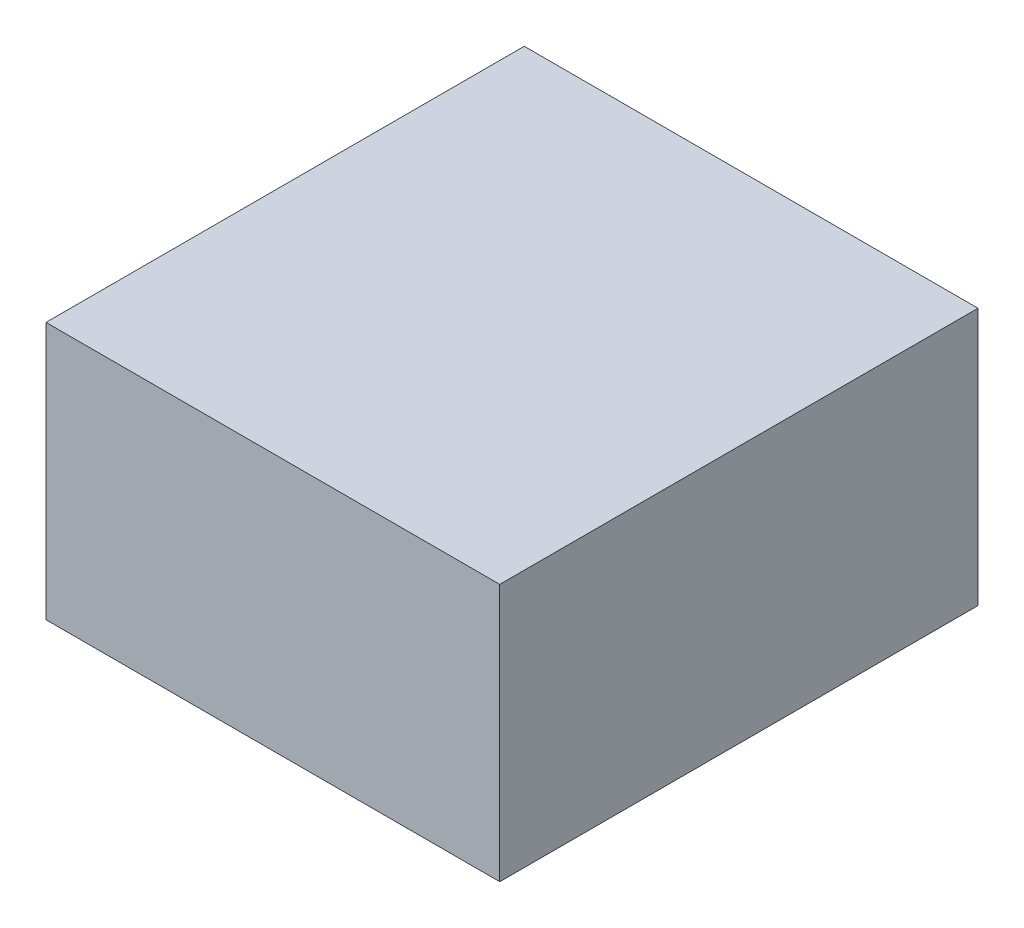
ISO-10303-21;
HEADER;
FILE_DESCRIPTION(('STEP AP214'),'2;1');
FILE_NAME('part.step','',(''),(''),'','','');
FILE_SCHEMA(('AUTOMOTIVE_DESIGN { 1 0 10303 214 1 1 1 1 }'));
ENDSEC;
DATA;
#1=APPLICATION_CONTEXT('core data for automotive mechanical design processes');
#2=APPLICATION_PROTOCOL_DEFINITION('international standard','automotive_design',2000,#1);
#3=PRODUCT_CONTEXT('',#1,'mechanical');
#4=PRODUCT('Part','Part','',(#3));
#5=PRODUCT_RELATED_PRODUCT_CATEGORY('part','',(#4));
#6=PRODUCT_DEFINITION_FORMATION('','',#4);
#7=PRODUCT_DEFINITION_CONTEXT('part definition',#1,'design');
#8=PRODUCT_DEFINITION('design','',#6,#7);
#9=PRODUCT_DEFINITION_SHAPE('','',#8);
#10=(LENGTH_UNIT() NAMED_UNIT(*) SI_UNIT(.MILLI.,.METRE.));
#11=(NAMED_UNIT(*) PLANE_ANGLE_UNIT() SI_UNIT($,.RADIAN.));
#12=(NAMED_UNIT(*) SI_UNIT($,.STERADIAN.) SOLID_ANGLE_UNIT());
#13=UNCERTAINTY_MEASURE_WITH_UNIT(LENGTH_MEASURE(1.E-05),#10,'distance_accuracy_value','');
#14=(GEOMETRIC_REPRESENTATION_CONTEXT(3) GLOBAL_UNCERTAINTY_ASSIGNED_CONTEXT((#13)) GLOBAL_UNIT_ASSIGNED_CONTEXT((#10,
#11,#12)) REPRESENTATION_CONTEXT('',''));
#15=CARTESIAN_POINT('',(0.,0.,0.));
#16=DIRECTION('',(0.,0.,1.));
#17=DIRECTION('',(1.,0.,0.));
#18=AXIS2_PLACEMENT_3D('',#15,#16,#17);
#19=CARTESIAN_POINT('',(185.,210.,195.));
#20=DIRECTION('',(-1.,0.,0.));
#21=DIRECTION('',(0.,0.,1.));
#22=AXIS2_PLACEMENT_3D('',#19,#20,#21);
#23=PLANE('',#22);
#24=DIRECTION('',(0.,0.,-1.));
#25=VECTOR('',#24,1.);
#26=CARTESIAN_POINT('',(185.,0.,195.));
#27=LINE('',#26,#25);
#28=CARTESIAN_POINT('',(185.,0.,195.));
#29=VERTEX_POINT('',#28);
#30=CARTESIAN_POINT('',(185.,0.,-195.));
#31=VERTEX_POINT('',#30);
#32=EDGE_CURVE('E113',#29,#31,#27,.T.);
#33=ORIENTED_EDGE('',*,*,#32,.T.);
#34=DIRECTION('',(0.,-1.,0.));
#35=VECTOR('',#34,1.);
#36=CARTESIAN_POINT('',(185.,210.,-195.));
#37=LINE('',#36,#35);
#38=CARTESIAN_POINT('',(185.,210.,-195.));
#39=VERTEX_POINT('',#38);
#40=EDGE_CURVE('E11',#39,#31,#37,.T.);
#41=ORIENTED_EDGE('',*,*,#40,.F.);
#42=DIRECTION('',(0.,0.,-1.));
#43=VECTOR('',#42,1.);
#44=CARTESIAN_POINT('',(185.,210.,195.));
#45=LINE('',#44,#43);
#46=CARTESIAN_POINT('',(185.,210.,195.));
#47=VERTEX_POINT('',#46);
#48=EDGE_CURVE('E97',#47,#39,#45,.T.);
#49=ORIENTED_EDGE('',*,*,#48,.F.);
#50=DIRECTION('',(0.,-1.,0.));
#51=VECTOR('',#50,1.);
#52=CARTESIAN_POINT('',(185.,210.,195.));
#53=LINE('',#52,#51);
#54=EDGE_CURVE('E109',#47,#29,#53,.T.);
#55=ORIENTED_EDGE('',*,*,#54,.T.);
#56=EDGE_LOOP('',(#33,#41,#49,#55));
#57=FACE_BOUND('',#56,.T.);
#58=ADVANCED_FACE('F45',(#57),#23,.F.);
#59=CARTESIAN_POINT('',(-185.,210.,-195.));
#60=DIRECTION('',(0.,0.,1.));
#61=DIRECTION('',(1.,0.,0.));
#62=AXIS2_PLACEMENT_3D('',#59,#60,#61);
#63=PLANE('',#62);
#64=DIRECTION('',(-1.,0.,0.));
#65=VECTOR('',#64,1.);
#66=CARTESIAN_POINT('',(-185.,0.,-195.));
#67=LINE('',#66,#65);
#68=CARTESIAN_POINT('',(-185.,0.,-195.));
#69=VERTEX_POINT('',#68);
#70=EDGE_CURVE('E102',#31,#69,#67,.T.);
#71=ORIENTED_EDGE('',*,*,#70,.T.);
#72=DIRECTION('',(0.,-1.,0.));
#73=VECTOR('',#72,1.);
#74=CARTESIAN_POINT('',(-185.,210.,-195.));
#75=LINE('',#74,#73);
#76=CARTESIAN_POINT('',(-185.,210.,-195.));
#77=VERTEX_POINT('',#76);
#78=EDGE_CURVE('E54',#77,#69,#75,.T.);
#79=ORIENTED_EDGE('',*,*,#78,.F.);
#80=DIRECTION('',(-1.,0.,0.));
#81=VECTOR('',#80,1.);
#82=CARTESIAN_POINT('',(-185.,210.,-195.));
#83=LINE('',#82,#81);
#84=EDGE_CURVE('E92',#39,#77,#83,.T.);
#85=ORIENTED_EDGE('',*,*,#84,.F.);
#86=ORIENTED_EDGE('',*,*,#40,.T.);
#87=EDGE_LOOP('',(#71,#79,#85,#86));
#88=FACE_BOUND('',#87,.T.);
#89=ADVANCED_FACE('F101',(#88),#63,.F.);
#90=CARTESIAN_POINT('',(-185.,210.,195.));
#91=DIRECTION('',(1.,0.,0.));
#92=DIRECTION('',(0.,0.,-1.));
#93=AXIS2_PLACEMENT_3D('',#90,#91,#92);
#94=PLANE('',#93);
#95=DIRECTION('',(0.,0.,1.));
#96=VECTOR('',#95,1.);
#97=CARTESIAN_POINT('',(-185.,0.,195.));
#98=LINE('',#97,#96);
#99=CARTESIAN_POINT('',(-185.,0.,195.));
#100=VERTEX_POINT('',#99);
#101=EDGE_CURVE('E79',#69,#100,#98,.T.);
#102=ORIENTED_EDGE('',*,*,#101,.T.);
#103=DIRECTION('',(0.,-1.,0.));
#104=VECTOR('',#103,1.);
#105=CARTESIAN_POINT('',(-185.,210.,195.));
#106=LINE('',#105,#104);
#107=CARTESIAN_POINT('',(-185.,210.,195.));
#108=VERTEX_POINT('',#107);
#109=EDGE_CURVE('E104',#108,#100,#106,.T.);
#110=ORIENTED_EDGE('',*,*,#109,.F.);
#111=DIRECTION('',(0.,0.,1.));
#112=VECTOR('',#111,1.);
#113=CARTESIAN_POINT('',(-185.,210.,195.));
#114=LINE('',#113,#112);
#115=EDGE_CURVE('E95',#77,#108,#114,.T.);
#116=ORIENTED_EDGE('',*,*,#115,.F.);
#117=ORIENTED_EDGE('',*,*,#78,.T.);
#118=EDGE_LOOP('',(#102,#110,#116,#117));
#119=FACE_BOUND('',#118,.T.);
#120=ADVANCED_FACE('F105',(#119),#94,.F.);
#121=CARTESIAN_POINT('',(-185.,210.,195.));
#122=DIRECTION('',(0.,0.,-1.));
#123=DIRECTION('',(-1.,0.,0.));
#124=AXIS2_PLACEMENT_3D('',#121,#122,#123);
#125=PLANE('',#124);
#126=DIRECTION('',(1.,0.,0.));
#127=VECTOR('',#126,1.);
#128=CARTESIAN_POINT('',(-185.,0.,195.));
#129=LINE('',#128,#127);
#130=EDGE_CURVE('E85',#100,#29,#129,.T.);
#131=ORIENTED_EDGE('',*,*,#130,.T.);
#132=ORIENTED_EDGE('',*,*,#54,.F.);
#133=DIRECTION('',(1.,0.,0.));
#134=VECTOR('',#133,1.);
#135=CARTESIAN_POINT('',(-185.,210.,195.));
#136=LINE('',#135,#134);
#137=EDGE_CURVE('E62',#108,#47,#136,.T.);
#138=ORIENTED_EDGE('',*,*,#137,.F.);
#139=ORIENTED_EDGE('',*,*,#109,.T.);
#140=EDGE_LOOP('',(#131,#132,#138,#139));
#141=FACE_BOUND('',#140,.T.);
#142=ADVANCED_FACE('F126',(#141),#125,.F.);
#143=CARTESIAN_POINT('',(0.,210.,0.));
#144=DIRECTION('',(0.,-1.,0.));
#145=DIRECTION('',(0.,0.,-1.));
#146=AXIS2_PLACEMENT_3D('',#143,#144,#145);
#147=PLANE('',#146);
#148=ORIENTED_EDGE('',*,*,#48,.T.);
#149=ORIENTED_EDGE('',*,*,#84,.T.);
#150=ORIENTED_EDGE('',*,*,#115,.T.);
#151=ORIENTED_EDGE('',*,*,#137,.T.);
#152=EDGE_LOOP('',(#148,#149,#150,#151));
#153=FACE_BOUND('',#152,.T.);
#154=ADVANCED_FACE('F93',(#153),#147,.F.);
#155=CARTESIAN_POINT('',(0.,0.,0.));
#156=DIRECTION('',(0.,-1.,0.));
#157=DIRECTION('',(0.,0.,-1.));
#158=AXIS2_PLACEMENT_3D('',#155,#156,#157);
#159=PLANE('',#158);
#160=ORIENTED_EDGE('',*,*,#32,.F.);
#161=ORIENTED_EDGE('',*,*,#130,.F.);
#162=ORIENTED_EDGE('',*,*,#101,.F.);
#163=ORIENTED_EDGE('',*,*,#70,.F.);
#164=EDGE_LOOP('',(#160,#161,#162,#163));
#165=FACE_BOUND('',#164,.T.);
#166=ADVANCED_FACE('F129',(#165),#159,.T.);
#167=CLOSED_SHELL('',(#58,#89,#120,#142,#154,#166));
#168=MANIFOLD_SOLID_BREP('B2',#167);
#169=ADVANCED_BREP_SHAPE_REPRESENTATION('',(#18,#168),#14);
#170=SHAPE_DEFINITION_REPRESENTATION(#9,#169);
ENDSEC;
END-ISO-10303-21;
